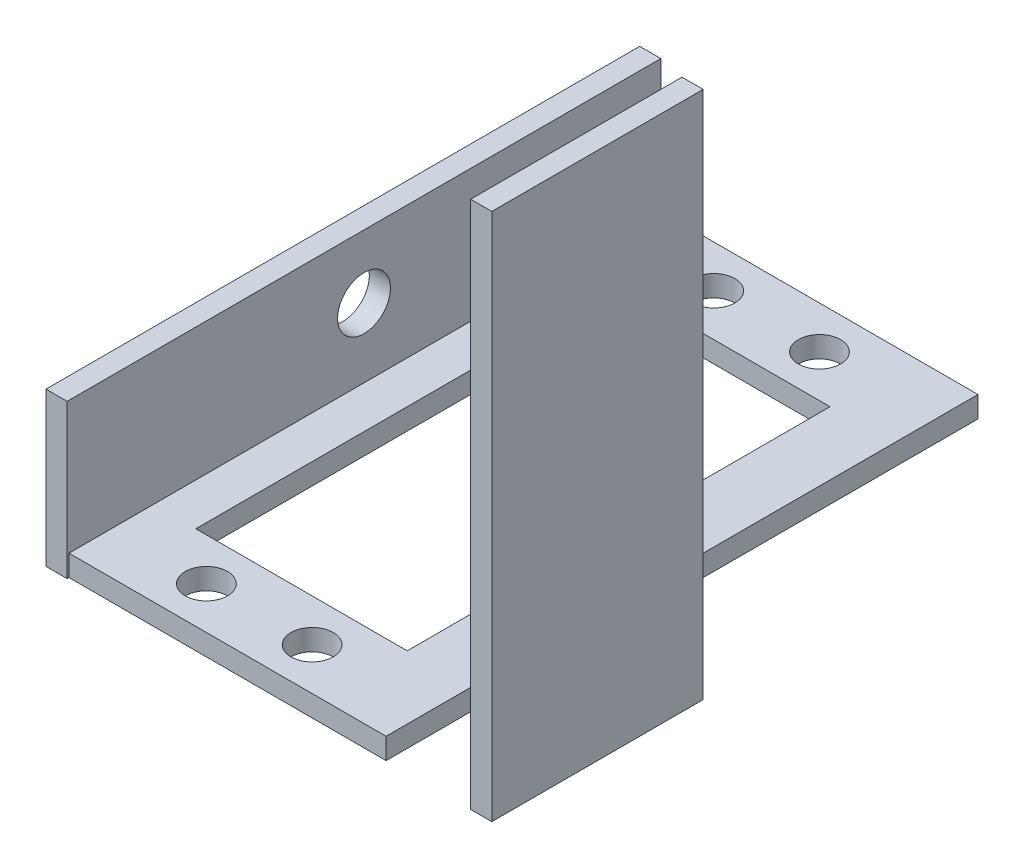
ISO-10303-21;
HEADER;
FILE_DESCRIPTION(('STEP AP214'),'2;1');
FILE_NAME('part.step','',(''),(''),'','','');
FILE_SCHEMA(('AUTOMOTIVE_DESIGN { 1 0 10303 214 1 1 1 1 }'));
ENDSEC;
DATA;
#1=APPLICATION_CONTEXT('core data for automotive mechanical design processes');
#2=APPLICATION_PROTOCOL_DEFINITION('international standard','automotive_design',2000,#1);
#3=PRODUCT_CONTEXT('',#1,'mechanical');
#4=PRODUCT('Part','Part','',(#3));
#5=PRODUCT_RELATED_PRODUCT_CATEGORY('part','',(#4));
#6=PRODUCT_DEFINITION_FORMATION('','',#4);
#7=PRODUCT_DEFINITION_CONTEXT('part definition',#1,'design');
#8=PRODUCT_DEFINITION('design','',#6,#7);
#9=PRODUCT_DEFINITION_SHAPE('','',#8);
#10=(LENGTH_UNIT() NAMED_UNIT(*) SI_UNIT(.MILLI.,.METRE.));
#11=(NAMED_UNIT(*) PLANE_ANGLE_UNIT() SI_UNIT($,.RADIAN.));
#12=(NAMED_UNIT(*) SI_UNIT($,.STERADIAN.) SOLID_ANGLE_UNIT());
#13=UNCERTAINTY_MEASURE_WITH_UNIT(LENGTH_MEASURE(1.E-05),#10,'distance_accuracy_value','');
#14=(GEOMETRIC_REPRESENTATION_CONTEXT(3) GLOBAL_UNCERTAINTY_ASSIGNED_CONTEXT((#13)) GLOBAL_UNIT_ASSIGNED_CONTEXT((#10,
#11,#12)) REPRESENTATION_CONTEXT('',''));
#15=CARTESIAN_POINT('',(0.,0.,0.));
#16=DIRECTION('',(0.,0.,1.));
#17=DIRECTION('',(1.,0.,0.));
#18=AXIS2_PLACEMENT_3D('',#15,#16,#17);
#19=CARTESIAN_POINT('',(15.6140938336516,0.,0.));
#20=DIRECTION('',(1.,0.,0.));
#21=DIRECTION('',(0.,0.,-1.));
#22=AXIS2_PLACEMENT_3D('',#19,#20,#21);
#23=PLANE('',#22);
#24=DIRECTION('',(0.,-1.,0.));
#25=VECTOR('',#24,1.);
#26=CARTESIAN_POINT('',(15.6140938336516,42.,11.5013167120157));
#27=LINE('',#26,#25);
#28=CARTESIAN_POINT('',(15.6140938336516,2.,11.5013167120157));
#29=VERTEX_POINT('',#28);
#30=CARTESIAN_POINT('',(15.6140938336516,0.,11.5013167120157));
#31=VERTEX_POINT('',#30);
#32=EDGE_CURVE('E11',#29,#31,#27,.T.);
#33=ORIENTED_EDGE('',*,*,#32,.F.);
#34=DIRECTION('',(0.,0.,1.));
#35=VECTOR('',#34,1.);
#36=CARTESIAN_POINT('',(15.6140938336516,2.,19.5013167120157));
#37=LINE('',#36,#35);
#38=CARTESIAN_POINT('',(15.6140938336516,2.,19.5013167120157));
#39=VERTEX_POINT('',#38);
#40=EDGE_CURVE('E282',#29,#39,#37,.T.);
#41=ORIENTED_EDGE('',*,*,#40,.T.);
#42=DIRECTION('',(0.,-1.,0.));
#43=VECTOR('',#42,1.);
#44=CARTESIAN_POINT('',(15.6140938336516,2.,19.5013167120157));
#45=LINE('',#44,#43);
#46=CARTESIAN_POINT('',(15.6140938336516,0.,19.5013167120157));
#47=VERTEX_POINT('',#46);
#48=EDGE_CURVE('E273',#39,#47,#45,.T.);
#49=ORIENTED_EDGE('',*,*,#48,.T.);
#50=DIRECTION('',(0.,0.,-1.));
#51=VECTOR('',#50,1.);
#52=CARTESIAN_POINT('',(15.6140938336516,0.,19.5013167120157));
#53=LINE('',#52,#51);
#54=EDGE_CURVE('E277',#47,#31,#53,.T.);
#55=ORIENTED_EDGE('',*,*,#54,.T.);
#56=EDGE_LOOP('',(#33,#41,#49,#55));
#57=FACE_BOUND('',#56,.T.);
#58=ADVANCED_FACE('F33',(#57),#23,.T.);
#59=CARTESIAN_POINT('',(9.61409383365159,0.,0.));
#60=DIRECTION('',(1.,0.,0.));
#61=DIRECTION('',(0.,0.,-1.));
#62=AXIS2_PLACEMENT_3D('',#59,#60,#61);
#63=PLANE('',#62);
#64=DIRECTION('',(0.,-1.,0.));
#65=VECTOR('',#64,1.);
#66=CARTESIAN_POINT('',(9.61409383365159,2.,-28.4986832879843));
#67=LINE('',#66,#65);
#68=CARTESIAN_POINT('',(9.61409383365159,2.,-28.4986832879843));
#69=VERTEX_POINT('',#68);
#70=CARTESIAN_POINT('',(9.61409383365159,0.,-28.4986832879843));
#71=VERTEX_POINT('',#70);
#72=EDGE_CURVE('E265',#69,#71,#67,.T.);
#73=ORIENTED_EDGE('',*,*,#72,.T.);
#74=DIRECTION('',(0.,0.,-1.));
#75=VECTOR('',#74,1.);
#76=CARTESIAN_POINT('',(9.61409383365159,0.,19.5013167120157));
#77=LINE('',#76,#75);
#78=CARTESIAN_POINT('',(9.61409383365159,0.,11.5013167120157));
#79=VERTEX_POINT('',#78);
#80=EDGE_CURVE('E272',#79,#71,#77,.T.);
#81=ORIENTED_EDGE('',*,*,#80,.F.);
#82=DIRECTION('',(0.,-1.,0.));
#83=VECTOR('',#82,1.);
#84=CARTESIAN_POINT('',(9.61409383365159,2.,11.5013167120157));
#85=LINE('',#84,#83);
#86=CARTESIAN_POINT('',(9.61409383365159,2.,11.5013167120157));
#87=VERTEX_POINT('',#86);
#88=EDGE_CURVE('E309',#87,#79,#85,.T.);
#89=ORIENTED_EDGE('',*,*,#88,.F.);
#90=DIRECTION('',(0.,0.,1.));
#91=VECTOR('',#90,1.);
#92=CARTESIAN_POINT('',(9.61409383365159,2.,19.5013167120157));
#93=LINE('',#92,#91);
#94=EDGE_CURVE('E226',#69,#87,#93,.T.);
#95=ORIENTED_EDGE('',*,*,#94,.F.);
#96=EDGE_LOOP('',(#73,#81,#89,#95));
#97=FACE_BOUND('',#96,.T.);
#98=ADVANCED_FACE('F334',(#97),#63,.F.);
#99=CARTESIAN_POINT('',(0.,2.,0.));
#100=DIRECTION('',(0.,1.,0.));
#101=DIRECTION('',(0.,0.,1.));
#102=AXIS2_PLACEMENT_3D('',#99,#100,#101);
#103=PLANE('',#102);
#104=DIRECTION('',(0.,0.,-1.));
#105=VECTOR('',#104,1.);
#106=CARTESIAN_POINT('',(-14.3859061663484,2.,-36.4986832879843));
#107=LINE('',#106,#105);
#108=CARTESIAN_POINT('',(-14.3859061663484,2.,19.5013167120157));
#109=VERTEX_POINT('',#108);
#110=CARTESIAN_POINT('',(-14.3859061663484,2.,-36.4986832879843));
#111=VERTEX_POINT('',#110);
#112=EDGE_CURVE('E220',#109,#111,#107,.T.);
#113=ORIENTED_EDGE('',*,*,#112,.F.);
#114=DIRECTION('',(1.,0.,0.));
#115=VECTOR('',#114,1.);
#116=CARTESIAN_POINT('',(-10.3859061663484,2.,19.5013167120157));
#117=LINE('',#116,#115);
#118=EDGE_CURVE('E302',#109,#39,#117,.T.);
#119=ORIENTED_EDGE('',*,*,#118,.T.);
#120=ORIENTED_EDGE('',*,*,#40,.F.);
#121=CARTESIAN_POINT('',(15.6140938336516,2.,-8.4986832879843));
#122=VERTEX_POINT('',#121);
#123=EDGE_CURVE('E284',#122,#29,#37,.T.);
#124=ORIENTED_EDGE('',*,*,#123,.F.);
#125=CARTESIAN_POINT('',(15.6140938336516,2.,-36.4986832879843));
#126=VERTEX_POINT('',#125);
#127=EDGE_CURVE('E232',#126,#122,#37,.T.);
#128=ORIENTED_EDGE('',*,*,#127,.F.);
#129=DIRECTION('',(-1.,0.,0.));
#130=VECTOR('',#129,1.);
#131=CARTESIAN_POINT('',(15.6140938336516,2.,-36.4986832879843));
#132=LINE('',#131,#130);
#133=EDGE_CURVE('E229',#126,#111,#132,.T.);
#134=ORIENTED_EDGE('',*,*,#133,.T.);
#135=EDGE_LOOP('',(#113,#119,#120,#124,#128,#134));
#136=FACE_BOUND('',#135,.T.);
#137=CARTESIAN_POINT('',(4.61409383365159,2.,15.5013167120157));
#138=DIRECTION('',(0.,1.,0.));
#139=DIRECTION('',(0.,0.,1.));
#140=AXIS2_PLACEMENT_3D('',#137,#138,#139);
#141=CIRCLE('',#140,2.);
#142=CARTESIAN_POINT('',(4.61409383365159,2.,17.5013167120157));
#143=VERTEX_POINT('',#142);
#144=EDGE_CURVE('E238',#143,#143,#141,.T.);
#145=ORIENTED_EDGE('',*,*,#144,.F.);
#146=EDGE_LOOP('',(#145));
#147=FACE_BOUND('',#146,.T.);
#148=DIRECTION('',(-1.,0.,0.));
#149=VECTOR('',#148,1.);
#150=CARTESIAN_POINT('',(-10.3859061663484,2.,11.5013167120157));
#151=LINE('',#150,#149);
#152=CARTESIAN_POINT('',(-10.3859061663484,2.,11.5013167120157));
#153=VERTEX_POINT('',#152);
#154=EDGE_CURVE('E305',#87,#153,#151,.T.);
#155=ORIENTED_EDGE('',*,*,#154,.T.);
#156=DIRECTION('',(0.,0.,-1.));
#157=VECTOR('',#156,1.);
#158=CARTESIAN_POINT('',(-10.3859061663484,2.,-36.4986832879843));
#159=LINE('',#158,#157);
#160=CARTESIAN_POINT('',(-10.3859061663484,2.,-28.4986832879843));
#161=VERTEX_POINT('',#160);
#162=EDGE_CURVE('E241',#153,#161,#159,.T.);
#163=ORIENTED_EDGE('',*,*,#162,.T.);
#164=DIRECTION('',(1.,0.,0.));
#165=VECTOR('',#164,1.);
#166=CARTESIAN_POINT('',(-10.3859061663484,2.,-28.4986832879843));
#167=LINE('',#166,#165);
#168=EDGE_CURVE('E263',#161,#69,#167,.T.);
#169=ORIENTED_EDGE('',*,*,#168,.T.);
#170=ORIENTED_EDGE('',*,*,#94,.T.);
#171=EDGE_LOOP('',(#155,#163,#169,#170));
#172=FACE_BOUND('',#171,.T.);
#173=CARTESIAN_POINT('',(-5.38590616634841,2.,15.5013167120157));
#174=DIRECTION('',(0.,1.,0.));
#175=DIRECTION('',(0.,0.,1.));
#176=AXIS2_PLACEMENT_3D('',#173,#174,#175);
#177=CIRCLE('',#176,2.);
#178=CARTESIAN_POINT('',(-5.38590616634841,2.,17.5013167120157));
#179=VERTEX_POINT('',#178);
#180=EDGE_CURVE('E291',#179,#179,#177,.T.);
#181=ORIENTED_EDGE('',*,*,#180,.F.);
#182=EDGE_LOOP('',(#181));
#183=FACE_BOUND('',#182,.T.);
#184=CARTESIAN_POINT('',(4.61409383365159,2.,-32.4986832879843));
#185=DIRECTION('',(0.,1.,0.));
#186=DIRECTION('',(0.,0.,1.));
#187=AXIS2_PLACEMENT_3D('',#184,#185,#186);
#188=CIRCLE('',#187,2.);
#189=CARTESIAN_POINT('',(4.61409383365159,2.,-30.4986832879843));
#190=VERTEX_POINT('',#189);
#191=EDGE_CURVE('E257',#190,#190,#188,.T.);
#192=ORIENTED_EDGE('',*,*,#191,.F.);
#193=EDGE_LOOP('',(#192));
#194=FACE_BOUND('',#193,.T.);
#195=CARTESIAN_POINT('',(-5.38590616634841,2.,-32.4986832879843));
#196=DIRECTION('',(0.,1.,0.));
#197=DIRECTION('',(0.,0.,1.));
#198=AXIS2_PLACEMENT_3D('',#195,#196,#197);
#199=CIRCLE('',#198,2.);
#200=CARTESIAN_POINT('',(-5.38590616634841,2.,-30.4986832879843));
#201=VERTEX_POINT('',#200);
#202=EDGE_CURVE('E251',#201,#201,#199,.T.);
#203=ORIENTED_EDGE('',*,*,#202,.F.);
#204=EDGE_LOOP('',(#203));
#205=FACE_BOUND('',#204,.T.);
#206=ADVANCED_FACE('F320',(#136,#147,#172,#183,#194,#205),#103,.T.);
#207=CARTESIAN_POINT('',(0.,0.,0.));
#208=DIRECTION('',(0.,1.,0.));
#209=DIRECTION('',(0.,0.,1.));
#210=AXIS2_PLACEMENT_3D('',#207,#208,#209);
#211=PLANE('',#210);
#212=DIRECTION('',(1.,0.,0.));
#213=VECTOR('',#212,1.);
#214=CARTESIAN_POINT('',(-10.3859061663484,0.,19.5013167120157));
#215=LINE('',#214,#213);
#216=CARTESIAN_POINT('',(-14.3859061663484,0.,19.5013167120157));
#217=VERTEX_POINT('',#216);
#218=EDGE_CURVE('E235',#217,#47,#215,.T.);
#219=ORIENTED_EDGE('',*,*,#218,.F.);
#220=DIRECTION('',(0.,0.,1.));
#221=VECTOR('',#220,1.);
#222=CARTESIAN_POINT('',(-14.3859061663484,0.,-36.4986832879843));
#223=LINE('',#222,#221);
#224=CARTESIAN_POINT('',(-14.3859061663484,0.,19.6765111813875));
#225=VERTEX_POINT('',#224);
#226=EDGE_CURVE('E210',#217,#225,#223,.T.);
#227=ORIENTED_EDGE('',*,*,#226,.T.);
#228=DIRECTION('',(1.,0.,0.));
#229=VECTOR('',#228,1.);
#230=CARTESIAN_POINT('',(-16.3859061663484,0.,19.6765111813875));
#231=LINE('',#230,#229);
#232=CARTESIAN_POINT('',(-16.3859061663484,0.,19.6765111813875));
#233=VERTEX_POINT('',#232);
#234=EDGE_CURVE('E211',#233,#225,#231,.T.);
#235=ORIENTED_EDGE('',*,*,#234,.F.);
#236=DIRECTION('',(0.,0.,1.));
#237=VECTOR('',#236,1.);
#238=CARTESIAN_POINT('',(-16.3859061663484,0.,-36.4986832879843));
#239=LINE('',#238,#237);
#240=CARTESIAN_POINT('',(-16.3859061663484,0.,-36.4986832879843));
#241=VERTEX_POINT('',#240);
#242=EDGE_CURVE('E194',#241,#233,#239,.T.);
#243=ORIENTED_EDGE('',*,*,#242,.F.);
#244=DIRECTION('',(-1.,0.,0.));
#245=VECTOR('',#244,1.);
#246=CARTESIAN_POINT('',(15.6140938336516,0.,-36.4986832879843));
#247=LINE('',#246,#245);
#248=CARTESIAN_POINT('',(15.6140938336516,0.,-36.4986832879843));
#249=VERTEX_POINT('',#248);
#250=EDGE_CURVE('E231',#249,#241,#247,.T.);
#251=ORIENTED_EDGE('',*,*,#250,.F.);
#252=CARTESIAN_POINT('',(15.6140938336516,0.,-8.4986832879843));
#253=VERTEX_POINT('',#252);
#254=EDGE_CURVE('E276',#253,#249,#53,.T.);
#255=ORIENTED_EDGE('',*,*,#254,.F.);
#256=EDGE_CURVE('E280',#31,#253,#53,.T.);
#257=ORIENTED_EDGE('',*,*,#256,.F.);
#258=ORIENTED_EDGE('',*,*,#54,.F.);
#259=EDGE_LOOP('',(#219,#227,#235,#243,#251,#255,#257,#258));
#260=FACE_BOUND('',#259,.T.);
#261=DIRECTION('',(0.,0.,1.));
#262=VECTOR('',#261,1.);
#263=CARTESIAN_POINT('',(-10.3859061663484,0.,-36.4986832879843));
#264=LINE('',#263,#262);
#265=CARTESIAN_POINT('',(-10.3859061663484,0.,-28.4986832879843));
#266=VERTEX_POINT('',#265);
#267=CARTESIAN_POINT('',(-10.3859061663484,0.,11.5013167120157));
#268=VERTEX_POINT('',#267);
#269=EDGE_CURVE('E217',#266,#268,#264,.T.);
#270=ORIENTED_EDGE('',*,*,#269,.T.);
#271=DIRECTION('',(-1.,0.,0.));
#272=VECTOR('',#271,1.);
#273=CARTESIAN_POINT('',(-10.3859061663484,0.,11.5013167120157));
#274=LINE('',#273,#272);
#275=EDGE_CURVE('E237',#79,#268,#274,.T.);
#276=ORIENTED_EDGE('',*,*,#275,.F.);
#277=ORIENTED_EDGE('',*,*,#80,.T.);
#278=DIRECTION('',(1.,0.,0.));
#279=VECTOR('',#278,1.);
#280=CARTESIAN_POINT('',(-10.3859061663484,0.,-28.4986832879843));
#281=LINE('',#280,#279);
#282=EDGE_CURVE('E260',#266,#71,#281,.T.);
#283=ORIENTED_EDGE('',*,*,#282,.F.);
#284=EDGE_LOOP('',(#270,#276,#277,#283));
#285=FACE_BOUND('',#284,.T.);
#286=CARTESIAN_POINT('',(4.61409383365159,0.,15.5013167120157));
#287=DIRECTION('',(0.,1.,0.));
#288=DIRECTION('',(0.,0.,1.));
#289=AXIS2_PLACEMENT_3D('',#286,#287,#288);
#290=CIRCLE('',#289,2.);
#291=CARTESIAN_POINT('',(4.61409383365159,0.,17.5013167120157));
#292=VERTEX_POINT('',#291);
#293=EDGE_CURVE('E294',#292,#292,#290,.T.);
#294=ORIENTED_EDGE('',*,*,#293,.T.);
#295=EDGE_LOOP('',(#294));
#296=FACE_BOUND('',#295,.T.);
#297=CARTESIAN_POINT('',(-5.38590616634841,0.,15.5013167120157));
#298=DIRECTION('',(0.,1.,0.));
#299=DIRECTION('',(0.,0.,1.));
#300=AXIS2_PLACEMENT_3D('',#297,#298,#299);
#301=CIRCLE('',#300,2.);
#302=CARTESIAN_POINT('',(-5.38590616634841,0.,17.5013167120157));
#303=VERTEX_POINT('',#302);
#304=EDGE_CURVE('E295',#303,#303,#301,.T.);
#305=ORIENTED_EDGE('',*,*,#304,.T.);
#306=EDGE_LOOP('',(#305));
#307=FACE_BOUND('',#306,.T.);
#308=CARTESIAN_POINT('',(4.61409383365159,0.,-32.4986832879843));
#309=DIRECTION('',(0.,1.,0.));
#310=DIRECTION('',(0.,0.,1.));
#311=AXIS2_PLACEMENT_3D('',#308,#309,#310);
#312=CIRCLE('',#311,2.);
#313=CARTESIAN_POINT('',(4.61409383365159,0.,-30.4986832879843));
#314=VERTEX_POINT('',#313);
#315=EDGE_CURVE('E254',#314,#314,#312,.T.);
#316=ORIENTED_EDGE('',*,*,#315,.T.);
#317=EDGE_LOOP('',(#316));
#318=FACE_BOUND('',#317,.T.);
#319=CARTESIAN_POINT('',(-5.38590616634841,0.,-32.4986832879843));
#320=DIRECTION('',(0.,1.,0.));
#321=DIRECTION('',(0.,0.,1.));
#322=AXIS2_PLACEMENT_3D('',#319,#320,#321);
#323=CIRCLE('',#322,2.);
#324=CARTESIAN_POINT('',(-5.38590616634841,0.,-30.4986832879843));
#325=VERTEX_POINT('',#324);
#326=EDGE_CURVE('E224',#325,#325,#323,.T.);
#327=ORIENTED_EDGE('',*,*,#326,.T.);
#328=EDGE_LOOP('',(#327));
#329=FACE_BOUND('',#328,.T.);
#330=ADVANCED_FACE('F336',(#260,#285,#296,#307,#318,#329),#211,.F.);
#331=CARTESIAN_POINT('',(-10.3859061663484,2.,19.5013167120157));
#332=DIRECTION('',(0.,0.,-1.));
#333=DIRECTION('',(-1.,0.,0.));
#334=AXIS2_PLACEMENT_3D('',#331,#332,#333);
#335=PLANE('',#334);
#336=ORIENTED_EDGE('',*,*,#218,.T.);
#337=ORIENTED_EDGE('',*,*,#48,.F.);
#338=ORIENTED_EDGE('',*,*,#118,.F.);
#339=DIRECTION('',(0.,1.,0.));
#340=VECTOR('',#339,1.);
#341=CARTESIAN_POINT('',(-14.3859061663484,2.,19.5013167120157));
#342=LINE('',#341,#340);
#343=EDGE_CURVE('E225',#217,#109,#342,.T.);
#344=ORIENTED_EDGE('',*,*,#343,.F.);
#345=EDGE_LOOP('',(#336,#337,#338,#344));
#346=FACE_BOUND('',#345,.T.);
#347=ADVANCED_FACE('F35',(#346),#335,.F.);
#348=CARTESIAN_POINT('',(-10.3859061663484,2.,11.5013167120157));
#349=DIRECTION('',(0.,0.,1.));
#350=DIRECTION('',(1.,0.,0.));
#351=AXIS2_PLACEMENT_3D('',#348,#349,#350);
#352=PLANE('',#351);
#353=ORIENTED_EDGE('',*,*,#275,.T.);
#354=DIRECTION('',(0.,-1.,0.));
#355=VECTOR('',#354,1.);
#356=CARTESIAN_POINT('',(-10.3859061663484,2.,11.5013167120157));
#357=LINE('',#356,#355);
#358=EDGE_CURVE('E306',#153,#268,#357,.T.);
#359=ORIENTED_EDGE('',*,*,#358,.F.);
#360=ORIENTED_EDGE('',*,*,#154,.F.);
#361=ORIENTED_EDGE('',*,*,#88,.T.);
#362=EDGE_LOOP('',(#353,#359,#360,#361));
#363=FACE_BOUND('',#362,.T.);
#364=ADVANCED_FACE('F325',(#363),#352,.F.);
#365=CARTESIAN_POINT('',(4.61409383365159,2.,15.5013167120157));
#366=DIRECTION('',(0.,-1.,0.));
#367=DIRECTION('',(0.,0.,-1.));
#368=AXIS2_PLACEMENT_3D('',#365,#366,#367);
#369=CYLINDRICAL_SURFACE('',#368,2.);
#370=ORIENTED_EDGE('',*,*,#144,.T.);
#371=EDGE_LOOP('',(#370));
#372=FACE_BOUND('',#371,.T.);
#373=ORIENTED_EDGE('',*,*,#293,.F.);
#374=EDGE_LOOP('',(#373));
#375=FACE_BOUND('',#374,.T.);
#376=ADVANCED_FACE('F382',(#372,#375),#369,.F.);
#377=CARTESIAN_POINT('',(-5.38590616634841,2.,15.5013167120157));
#378=DIRECTION('',(0.,-1.,0.));
#379=DIRECTION('',(0.,0.,-1.));
#380=AXIS2_PLACEMENT_3D('',#377,#378,#379);
#381=CYLINDRICAL_SURFACE('',#380,2.);
#382=ORIENTED_EDGE('',*,*,#180,.T.);
#383=EDGE_LOOP('',(#382));
#384=FACE_BOUND('',#383,.T.);
#385=ORIENTED_EDGE('',*,*,#304,.F.);
#386=EDGE_LOOP('',(#385));
#387=FACE_BOUND('',#386,.T.);
#388=ADVANCED_FACE('F376',(#384,#387),#381,.F.);
#389=CARTESIAN_POINT('',(15.6140938336516,2.,-36.4986832879843));
#390=DIRECTION('',(0.,0.,1.));
#391=DIRECTION('',(1.,0.,0.));
#392=AXIS2_PLACEMENT_3D('',#389,#390,#391);
#393=PLANE('',#392);
#394=ORIENTED_EDGE('',*,*,#250,.T.);
#395=DIRECTION('',(0.,-1.,0.));
#396=VECTOR('',#395,1.);
#397=CARTESIAN_POINT('',(-16.3859061663484,0.,-36.4986832879843));
#398=LINE('',#397,#396);
#399=CARTESIAN_POINT('',(-16.3859061663484,14.5283077447971,-36.4986832879843));
#400=VERTEX_POINT('',#399);
#401=EDGE_CURVE('E191',#400,#241,#398,.T.);
#402=ORIENTED_EDGE('',*,*,#401,.F.);
#403=DIRECTION('',(1.,0.,0.));
#404=VECTOR('',#403,1.);
#405=CARTESIAN_POINT('',(-16.3859061663484,14.5283077447971,-36.4986832879843));
#406=LINE('',#405,#404);
#407=CARTESIAN_POINT('',(-14.3859061663484,14.5283077447971,-36.4986832879843));
#408=VERTEX_POINT('',#407);
#409=EDGE_CURVE('E201',#400,#408,#406,.T.);
#410=ORIENTED_EDGE('',*,*,#409,.T.);
#411=DIRECTION('',(0.,-1.,0.));
#412=VECTOR('',#411,1.);
#413=CARTESIAN_POINT('',(-14.3859061663484,0.,-36.4986832879843));
#414=LINE('',#413,#412);
#415=EDGE_CURVE('E189',#408,#111,#414,.T.);
#416=ORIENTED_EDGE('',*,*,#415,.T.);
#417=ORIENTED_EDGE('',*,*,#133,.F.);
#418=DIRECTION('',(0.,1.,0.));
#419=VECTOR('',#418,1.);
#420=CARTESIAN_POINT('',(15.6140938336516,2.,-36.4986832879843));
#421=LINE('',#420,#419);
#422=EDGE_CURVE('E279',#249,#126,#421,.T.);
#423=ORIENTED_EDGE('',*,*,#422,.F.);
#424=EDGE_LOOP('',(#394,#402,#410,#416,#417,#423));
#425=FACE_BOUND('',#424,.T.);
#426=ADVANCED_FACE('F371',(#425),#393,.F.);
#427=DIRECTION('',(0.,1.,0.));
#428=VECTOR('',#427,1.);
#429=CARTESIAN_POINT('',(15.6140938336516,42.,-8.4986832879843));
#430=LINE('',#429,#428);
#431=EDGE_CURVE('E42',#253,#122,#430,.T.);
#432=ORIENTED_EDGE('',*,*,#431,.F.);
#433=ORIENTED_EDGE('',*,*,#254,.T.);
#434=ORIENTED_EDGE('',*,*,#422,.T.);
#435=ORIENTED_EDGE('',*,*,#127,.T.);
#436=EDGE_LOOP('',(#432,#433,#434,#435));
#437=FACE_BOUND('',#436,.T.);
#438=ADVANCED_FACE('F364',(#437),#23,.T.);
#439=CARTESIAN_POINT('',(-10.3859061663484,2.,-28.4986832879843));
#440=DIRECTION('',(0.,0.,-1.));
#441=DIRECTION('',(-1.,0.,0.));
#442=AXIS2_PLACEMENT_3D('',#439,#440,#441);
#443=PLANE('',#442);
#444=ORIENTED_EDGE('',*,*,#282,.T.);
#445=ORIENTED_EDGE('',*,*,#72,.F.);
#446=ORIENTED_EDGE('',*,*,#168,.F.);
#447=DIRECTION('',(0.,-1.,0.));
#448=VECTOR('',#447,1.);
#449=CARTESIAN_POINT('',(-10.3859061663484,2.,-28.4986832879843));
#450=LINE('',#449,#448);
#451=EDGE_CURVE('E269',#161,#266,#450,.T.);
#452=ORIENTED_EDGE('',*,*,#451,.T.);
#453=EDGE_LOOP('',(#444,#445,#446,#452));
#454=FACE_BOUND('',#453,.T.);
#455=ADVANCED_FACE('F331',(#454),#443,.F.);
#456=CARTESIAN_POINT('',(4.61409383365159,2.,-32.4986832879843));
#457=DIRECTION('',(0.,-1.,0.));
#458=DIRECTION('',(0.,0.,-1.));
#459=AXIS2_PLACEMENT_3D('',#456,#457,#458);
#460=CYLINDRICAL_SURFACE('',#459,2.);
#461=ORIENTED_EDGE('',*,*,#191,.T.);
#462=EDGE_LOOP('',(#461));
#463=FACE_BOUND('',#462,.T.);
#464=ORIENTED_EDGE('',*,*,#315,.F.);
#465=EDGE_LOOP('',(#464));
#466=FACE_BOUND('',#465,.T.);
#467=ADVANCED_FACE('F351',(#463,#466),#460,.F.);
#468=CARTESIAN_POINT('',(-5.38590616634841,2.,-32.4986832879843));
#469=DIRECTION('',(0.,-1.,0.));
#470=DIRECTION('',(0.,0.,-1.));
#471=AXIS2_PLACEMENT_3D('',#468,#469,#470);
#472=CYLINDRICAL_SURFACE('',#471,2.);
#473=ORIENTED_EDGE('',*,*,#202,.T.);
#474=EDGE_LOOP('',(#473));
#475=FACE_BOUND('',#474,.T.);
#476=ORIENTED_EDGE('',*,*,#326,.F.);
#477=EDGE_LOOP('',(#476));
#478=FACE_BOUND('',#477,.T.);
#479=ADVANCED_FACE('F349',(#475,#478),#472,.F.);
#480=CARTESIAN_POINT('',(-10.3859061663484,0.,0.));
#481=DIRECTION('',(-1.,0.,0.));
#482=DIRECTION('',(0.,0.,1.));
#483=AXIS2_PLACEMENT_3D('',#480,#481,#482);
#484=PLANE('',#483);
#485=ORIENTED_EDGE('',*,*,#162,.F.);
#486=ORIENTED_EDGE('',*,*,#358,.T.);
#487=ORIENTED_EDGE('',*,*,#269,.F.);
#488=ORIENTED_EDGE('',*,*,#451,.F.);
#489=EDGE_LOOP('',(#485,#486,#487,#488));
#490=FACE_BOUND('',#489,.T.);
#491=ADVANCED_FACE('F328',(#490),#484,.F.);
#492=CARTESIAN_POINT('',(-16.3859061663484,0.,19.6765111813875));
#493=DIRECTION('',(0.,0.,-1.));
#494=DIRECTION('',(-1.,0.,0.));
#495=AXIS2_PLACEMENT_3D('',#492,#493,#494);
#496=PLANE('',#495);
#497=DIRECTION('',(0.,1.,0.));
#498=VECTOR('',#497,1.);
#499=CARTESIAN_POINT('',(-14.3859061663484,0.,19.6765111813875));
#500=LINE('',#499,#498);
#501=CARTESIAN_POINT('',(-14.3859061663484,14.5283077447971,19.6765111813875));
#502=VERTEX_POINT('',#501);
#503=EDGE_CURVE('E214',#225,#502,#500,.T.);
#504=ORIENTED_EDGE('',*,*,#503,.T.);
#505=DIRECTION('',(1.,0.,0.));
#506=VECTOR('',#505,1.);
#507=CARTESIAN_POINT('',(-16.3859061663484,14.5283077447971,19.6765111813875));
#508=LINE('',#507,#506);
#509=CARTESIAN_POINT('',(-16.3859061663484,14.5283077447971,19.6765111813875));
#510=VERTEX_POINT('',#509);
#511=EDGE_CURVE('E416',#510,#502,#508,.T.);
#512=ORIENTED_EDGE('',*,*,#511,.F.);
#513=DIRECTION('',(0.,1.,0.));
#514=VECTOR('',#513,1.);
#515=CARTESIAN_POINT('',(-16.3859061663484,0.,19.6765111813875));
#516=LINE('',#515,#514);
#517=EDGE_CURVE('E197',#233,#510,#516,.T.);
#518=ORIENTED_EDGE('',*,*,#517,.F.);
#519=ORIENTED_EDGE('',*,*,#234,.T.);
#520=EDGE_LOOP('',(#504,#512,#518,#519));
#521=FACE_BOUND('',#520,.T.);
#522=ADVANCED_FACE('F358',(#521),#496,.F.);
#523=CARTESIAN_POINT('',(-16.3859061663484,14.5283077447971,-36.4986832879843));
#524=DIRECTION('',(0.,-1.,0.));
#525=DIRECTION('',(0.,0.,-1.));
#526=AXIS2_PLACEMENT_3D('',#523,#524,#525);
#527=PLANE('',#526);
#528=DIRECTION('',(0.,0.,-1.));
#529=VECTOR('',#528,1.);
#530=CARTESIAN_POINT('',(-14.3859061663484,14.5283077447971,-36.4986832879843));
#531=LINE('',#530,#529);
#532=EDGE_CURVE('E195',#502,#408,#531,.T.);
#533=ORIENTED_EDGE('',*,*,#532,.T.);
#534=ORIENTED_EDGE('',*,*,#409,.F.);
#535=DIRECTION('',(0.,0.,-1.));
#536=VECTOR('',#535,1.);
#537=CARTESIAN_POINT('',(-16.3859061663484,14.5283077447971,-36.4986832879843));
#538=LINE('',#537,#536);
#539=EDGE_CURVE('E199',#510,#400,#538,.T.);
#540=ORIENTED_EDGE('',*,*,#539,.F.);
#541=ORIENTED_EDGE('',*,*,#511,.T.);
#542=EDGE_LOOP('',(#533,#534,#540,#541));
#543=FACE_BOUND('',#542,.T.);
#544=ADVANCED_FACE('F426',(#543),#527,.F.);
#545=CARTESIAN_POINT('',(-16.3859061663484,0.,0.));
#546=DIRECTION('',(1.,0.,0.));
#547=DIRECTION('',(0.,0.,-1.));
#548=AXIS2_PLACEMENT_3D('',#545,#546,#547);
#549=PLANE('',#548);
#550=CARTESIAN_POINT('',(-16.3859061663484,8.52830774479708,-8.41108605329842));
#551=DIRECTION('',(-1.,0.,0.));
#552=DIRECTION('',(0.,0.,1.));
#553=AXIS2_PLACEMENT_3D('',#550,#551,#552);
#554=CIRCLE('',#553,2.5);
#555=CARTESIAN_POINT('',(-16.3859061663484,8.52830774479708,-5.91108605329842));
#556=VERTEX_POINT('',#555);
#557=EDGE_CURVE('E179',#556,#556,#554,.T.);
#558=ORIENTED_EDGE('',*,*,#557,.F.);
#559=EDGE_LOOP('',(#558));
#560=FACE_BOUND('',#559,.T.);
#561=ORIENTED_EDGE('',*,*,#401,.T.);
#562=ORIENTED_EDGE('',*,*,#242,.T.);
#563=ORIENTED_EDGE('',*,*,#517,.T.);
#564=ORIENTED_EDGE('',*,*,#539,.T.);
#565=EDGE_LOOP('',(#561,#562,#563,#564));
#566=FACE_BOUND('',#565,.T.);
#567=ADVANCED_FACE('F428',(#560,#566),#549,.F.);
#568=CARTESIAN_POINT('',(-14.3859061663484,0.,0.));
#569=DIRECTION('',(1.,0.,0.));
#570=DIRECTION('',(0.,0.,-1.));
#571=AXIS2_PLACEMENT_3D('',#568,#569,#570);
#572=PLANE('',#571);
#573=CARTESIAN_POINT('',(-14.3859061663484,8.52830774479708,-8.41108605329842));
#574=DIRECTION('',(-1.,0.,0.));
#575=DIRECTION('',(0.,0.,1.));
#576=AXIS2_PLACEMENT_3D('',#573,#574,#575);
#577=CIRCLE('',#576,2.5);
#578=CARTESIAN_POINT('',(-14.3859061663484,8.52830774479708,-5.91108605329842));
#579=VERTEX_POINT('',#578);
#580=EDGE_CURVE('E182',#579,#579,#577,.T.);
#581=ORIENTED_EDGE('',*,*,#580,.T.);
#582=EDGE_LOOP('',(#581));
#583=FACE_BOUND('',#582,.T.);
#584=ORIENTED_EDGE('',*,*,#226,.F.);
#585=ORIENTED_EDGE('',*,*,#343,.T.);
#586=ORIENTED_EDGE('',*,*,#112,.T.);
#587=ORIENTED_EDGE('',*,*,#415,.F.);
#588=ORIENTED_EDGE('',*,*,#532,.F.);
#589=ORIENTED_EDGE('',*,*,#503,.F.);
#590=EDGE_LOOP('',(#584,#585,#586,#587,#588,#589));
#591=FACE_BOUND('',#590,.T.);
#592=ADVANCED_FACE('F408',(#583,#591),#572,.T.);
#593=CARTESIAN_POINT('',(-14.3859061663484,8.52830774479708,-8.41108605329842));
#594=DIRECTION('',(-1.,0.,0.));
#595=DIRECTION('',(0.,0.,1.));
#596=AXIS2_PLACEMENT_3D('',#593,#594,#595);
#597=CYLINDRICAL_SURFACE('',#596,2.5);
#598=ORIENTED_EDGE('',*,*,#580,.F.);
#599=EDGE_LOOP('',(#598));
#600=FACE_BOUND('',#599,.T.);
#601=ORIENTED_EDGE('',*,*,#557,.T.);
#602=EDGE_LOOP('',(#601));
#603=FACE_BOUND('',#602,.T.);
#604=ADVANCED_FACE('F463',(#600,#603),#597,.F.);
#605=CARTESIAN_POINT('',(15.6140938336516,0.,0.));
#606=DIRECTION('',(1.,0.,0.));
#607=DIRECTION('',(0.,0.,-1.));
#608=AXIS2_PLACEMENT_3D('',#605,#606,#607);
#609=PLANE('',#608);
#610=CARTESIAN_POINT('',(15.6140938336516,-8.,11.5013167120157));
#611=VERTEX_POINT('',#610);
#612=EDGE_CURVE('E45',#31,#611,#27,.T.);
#613=ORIENTED_EDGE('',*,*,#612,.F.);
#614=ORIENTED_EDGE('',*,*,#256,.T.);
#615=CARTESIAN_POINT('',(15.6140938336516,-8.,-8.49868328798431));
#616=VERTEX_POINT('',#615);
#617=EDGE_CURVE('E435',#616,#253,#430,.T.);
#618=ORIENTED_EDGE('',*,*,#617,.F.);
#619=DIRECTION('',(0.,0.,-1.));
#620=VECTOR('',#619,1.);
#621=CARTESIAN_POINT('',(15.6140938336516,-8.,11.5013167120157));
#622=LINE('',#621,#620);
#623=EDGE_CURVE('E441',#611,#616,#622,.T.);
#624=ORIENTED_EDGE('',*,*,#623,.F.);
#625=EDGE_LOOP('',(#613,#614,#618,#624));
#626=FACE_BOUND('',#625,.T.);
#627=ADVANCED_FACE('F434',(#626),#609,.F.);
#628=CARTESIAN_POINT('',(15.6140938336516,42.,-8.4986832879843));
#629=VERTEX_POINT('',#628);
#630=EDGE_CURVE('E438',#122,#629,#430,.T.);
#631=ORIENTED_EDGE('',*,*,#630,.F.);
#632=ORIENTED_EDGE('',*,*,#123,.T.);
#633=CARTESIAN_POINT('',(15.6140938336516,42.,11.5013167120157));
#634=VERTEX_POINT('',#633);
#635=EDGE_CURVE('E44',#634,#29,#27,.T.);
#636=ORIENTED_EDGE('',*,*,#635,.F.);
#637=DIRECTION('',(0.,0.,1.));
#638=VECTOR('',#637,1.);
#639=CARTESIAN_POINT('',(15.6140938336516,42.,11.5013167120157));
#640=LINE('',#639,#638);
#641=EDGE_CURVE('E173',#629,#634,#640,.T.);
#642=ORIENTED_EDGE('',*,*,#641,.F.);
#643=EDGE_LOOP('',(#631,#632,#636,#642));
#644=FACE_BOUND('',#643,.T.);
#645=ADVANCED_FACE('F453',(#644),#609,.F.);
#646=CARTESIAN_POINT('',(17.6140938336516,42.,11.5013167120157));
#647=DIRECTION('',(0.,0.,-1.));
#648=DIRECTION('',(0.,1.,0.));
#649=AXIS2_PLACEMENT_3D('',#646,#647,#648);
#650=PLANE('',#649);
#651=ORIENTED_EDGE('',*,*,#635,.T.);
#652=ORIENTED_EDGE('',*,*,#32,.T.);
#653=ORIENTED_EDGE('',*,*,#612,.T.);
#654=DIRECTION('',(-1.,0.,0.));
#655=VECTOR('',#654,1.);
#656=CARTESIAN_POINT('',(17.6140938336516,-8.,11.5013167120157));
#657=LINE('',#656,#655);
#658=CARTESIAN_POINT('',(17.6140938336516,-8.,11.5013167120157));
#659=VERTEX_POINT('',#658);
#660=EDGE_CURVE('E158',#659,#611,#657,.T.);
#661=ORIENTED_EDGE('',*,*,#660,.F.);
#662=DIRECTION('',(0.,-1.,0.));
#663=VECTOR('',#662,1.);
#664=CARTESIAN_POINT('',(17.6140938336516,42.,11.5013167120157));
#665=LINE('',#664,#663);
#666=CARTESIAN_POINT('',(17.6140938336516,42.,11.5013167120157));
#667=VERTEX_POINT('',#666);
#668=EDGE_CURVE('E164',#667,#659,#665,.T.);
#669=ORIENTED_EDGE('',*,*,#668,.F.);
#670=DIRECTION('',(-1.,0.,0.));
#671=VECTOR('',#670,1.);
#672=CARTESIAN_POINT('',(17.6140938336516,42.,11.5013167120157));
#673=LINE('',#672,#671);
#674=EDGE_CURVE('E444',#667,#634,#673,.T.);
#675=ORIENTED_EDGE('',*,*,#674,.T.);
#676=EDGE_LOOP('',(#651,#652,#653,#661,#669,#675));
#677=FACE_BOUND('',#676,.T.);
#678=ADVANCED_FACE('F176',(#677),#650,.F.);
#679=CARTESIAN_POINT('',(17.6140938336516,-8.,11.5013167120157));
#680=DIRECTION('',(0.,1.,0.));
#681=DIRECTION('',(0.,0.,1.));
#682=AXIS2_PLACEMENT_3D('',#679,#680,#681);
#683=PLANE('',#682);
#684=ORIENTED_EDGE('',*,*,#623,.T.);
#685=DIRECTION('',(-1.,0.,0.));
#686=VECTOR('',#685,1.);
#687=CARTESIAN_POINT('',(17.6140938336516,-8.,-8.49868328798431));
#688=LINE('',#687,#686);
#689=CARTESIAN_POINT('',(17.6140938336516,-8.,-8.49868328798431));
#690=VERTEX_POINT('',#689);
#691=EDGE_CURVE('E160',#690,#616,#688,.T.);
#692=ORIENTED_EDGE('',*,*,#691,.F.);
#693=DIRECTION('',(0.,0.,-1.));
#694=VECTOR('',#693,1.);
#695=CARTESIAN_POINT('',(17.6140938336516,-8.,11.5013167120157));
#696=LINE('',#695,#694);
#697=EDGE_CURVE('E154',#659,#690,#696,.T.);
#698=ORIENTED_EDGE('',*,*,#697,.F.);
#699=ORIENTED_EDGE('',*,*,#660,.T.);
#700=EDGE_LOOP('',(#684,#692,#698,#699));
#701=FACE_BOUND('',#700,.T.);
#702=ADVANCED_FACE('F156',(#701),#683,.F.);
#703=CARTESIAN_POINT('',(17.6140938336516,42.,-8.4986832879843));
#704=DIRECTION('',(0.,0.,1.));
#705=DIRECTION('',(0.,-1.,0.));
#706=AXIS2_PLACEMENT_3D('',#703,#704,#705);
#707=PLANE('',#706);
#708=ORIENTED_EDGE('',*,*,#617,.T.);
#709=ORIENTED_EDGE('',*,*,#431,.T.);
#710=ORIENTED_EDGE('',*,*,#630,.T.);
#711=DIRECTION('',(-1.,0.,0.));
#712=VECTOR('',#711,1.);
#713=CARTESIAN_POINT('',(17.6140938336516,42.,-8.4986832879843));
#714=LINE('',#713,#712);
#715=CARTESIAN_POINT('',(17.6140938336516,42.,-8.4986832879843));
#716=VERTEX_POINT('',#715);
#717=EDGE_CURVE('E184',#716,#629,#714,.T.);
#718=ORIENTED_EDGE('',*,*,#717,.F.);
#719=DIRECTION('',(0.,1.,0.));
#720=VECTOR('',#719,1.);
#721=CARTESIAN_POINT('',(17.6140938336516,42.,-8.4986832879843));
#722=LINE('',#721,#720);
#723=EDGE_CURVE('E163',#690,#716,#722,.T.);
#724=ORIENTED_EDGE('',*,*,#723,.F.);
#725=ORIENTED_EDGE('',*,*,#691,.T.);
#726=EDGE_LOOP('',(#708,#709,#710,#718,#724,#725));
#727=FACE_BOUND('',#726,.T.);
#728=ADVANCED_FACE('F437',(#727),#707,.F.);
#729=CARTESIAN_POINT('',(17.6140938336516,42.,11.5013167120157));
#730=DIRECTION('',(0.,-1.,0.));
#731=DIRECTION('',(0.,0.,-1.));
#732=AXIS2_PLACEMENT_3D('',#729,#730,#731);
#733=PLANE('',#732);
#734=ORIENTED_EDGE('',*,*,#641,.T.);
#735=ORIENTED_EDGE('',*,*,#674,.F.);
#736=DIRECTION('',(0.,0.,1.));
#737=VECTOR('',#736,1.);
#738=CARTESIAN_POINT('',(17.6140938336516,42.,11.5013167120157));
#739=LINE('',#738,#737);
#740=EDGE_CURVE('E169',#716,#667,#739,.T.);
#741=ORIENTED_EDGE('',*,*,#740,.F.);
#742=ORIENTED_EDGE('',*,*,#717,.T.);
#743=EDGE_LOOP('',(#734,#735,#741,#742));
#744=FACE_BOUND('',#743,.T.);
#745=ADVANCED_FACE('F449',(#744),#733,.F.);
#746=CARTESIAN_POINT('',(17.6140938336516,0.,0.));
#747=DIRECTION('',(1.,0.,0.));
#748=DIRECTION('',(0.,0.,-1.));
#749=AXIS2_PLACEMENT_3D('',#746,#747,#748);
#750=PLANE('',#749);
#751=ORIENTED_EDGE('',*,*,#668,.T.);
#752=ORIENTED_EDGE('',*,*,#697,.T.);
#753=ORIENTED_EDGE('',*,*,#723,.T.);
#754=ORIENTED_EDGE('',*,*,#740,.T.);
#755=EDGE_LOOP('',(#751,#752,#753,#754));
#756=FACE_BOUND('',#755,.T.);
#757=ADVANCED_FACE('F167',(#756),#750,.T.);
#758=CLOSED_SHELL('',(#58,#98,#206,#330,#347,#364,#376,#388,#426,#438,#455,#467,#479,#491,#522,
#544,#567,#592,#604,#627,#645,#678,#702,#728,#745,#757));
#759=MANIFOLD_SOLID_BREP('B2',#758);
#760=ADVANCED_BREP_SHAPE_REPRESENTATION('',(#18,#759),#14);
#761=SHAPE_DEFINITION_REPRESENTATION(#9,#760);
ENDSEC;
END-ISO-10303-21;
